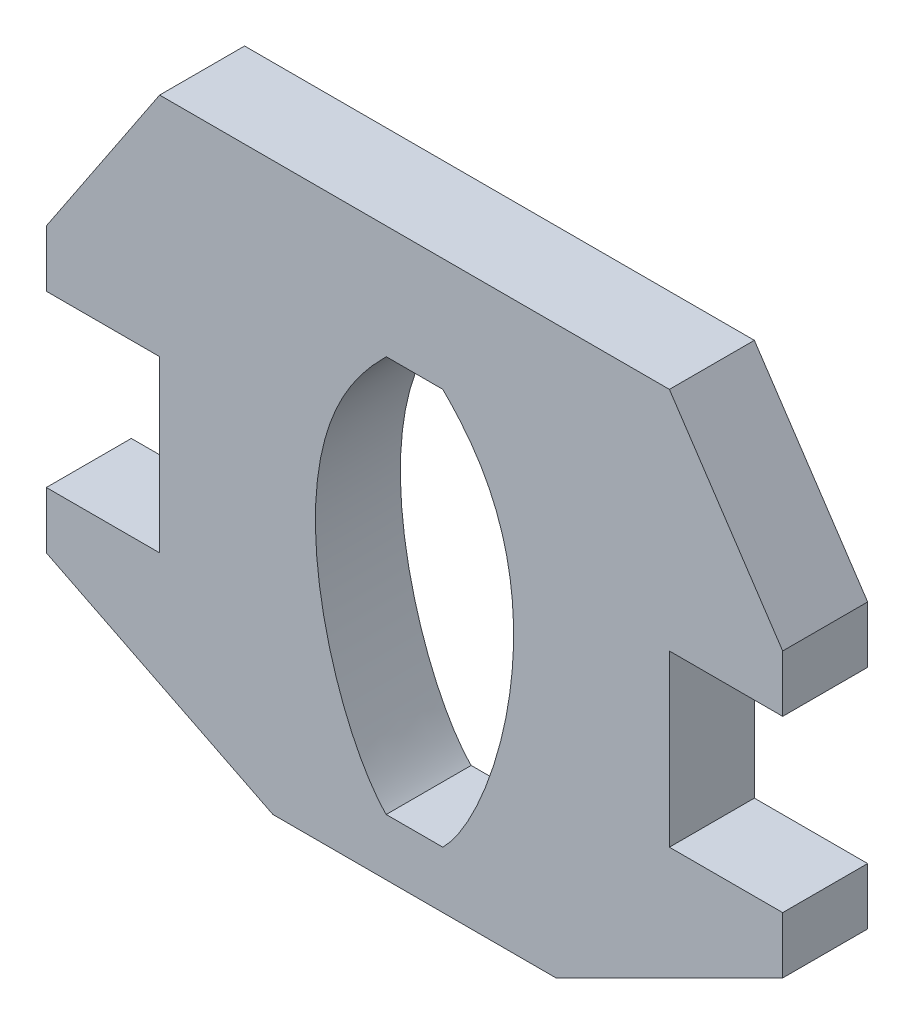
ISO-10303-21;
HEADER;
FILE_DESCRIPTION(('STEP AP214'),'2;1');
FILE_NAME('part.step','',(''),(''),'','','');
FILE_SCHEMA(('AUTOMOTIVE_DESIGN { 1 0 10303 214 1 1 1 1 }'));
ENDSEC;
DATA;
#1=APPLICATION_CONTEXT('core data for automotive mechanical design processes');
#2=APPLICATION_PROTOCOL_DEFINITION('international standard','automotive_design',2000,#1);
#3=PRODUCT_CONTEXT('',#1,'mechanical');
#4=PRODUCT('Part','Part','',(#3));
#5=PRODUCT_RELATED_PRODUCT_CATEGORY('part','',(#4));
#6=PRODUCT_DEFINITION_FORMATION('','',#4);
#7=PRODUCT_DEFINITION_CONTEXT('part definition',#1,'design');
#8=PRODUCT_DEFINITION('design','',#6,#7);
#9=PRODUCT_DEFINITION_SHAPE('','',#8);
#10=(LENGTH_UNIT() NAMED_UNIT(*) SI_UNIT(.MILLI.,.METRE.));
#11=(NAMED_UNIT(*) PLANE_ANGLE_UNIT() SI_UNIT($,.RADIAN.));
#12=(NAMED_UNIT(*) SI_UNIT($,.STERADIAN.) SOLID_ANGLE_UNIT());
#13=UNCERTAINTY_MEASURE_WITH_UNIT(LENGTH_MEASURE(1.E-05),#10,'distance_accuracy_value','');
#14=(GEOMETRIC_REPRESENTATION_CONTEXT(3) GLOBAL_UNCERTAINTY_ASSIGNED_CONTEXT((#13)) GLOBAL_UNIT_ASSIGNED_CONTEXT((#10,
#11,#12)) REPRESENTATION_CONTEXT('',''));
#15=CARTESIAN_POINT('',(0.,0.,0.));
#16=DIRECTION('',(0.,0.,1.));
#17=DIRECTION('',(1.,0.,0.));
#18=AXIS2_PLACEMENT_3D('',#15,#16,#17);
#19=CARTESIAN_POINT('',(0.,0.,15.));
#20=DIRECTION('',(0.,0.,1.));
#21=DIRECTION('',(1.,0.,0.));
#22=AXIS2_PLACEMENT_3D('',#19,#20,#21);
#23=PLANE('',#22);
#24=DIRECTION('',(-0.554700196225229,-0.832050294337844,0.));
#25=VECTOR('',#24,1.);
#26=CARTESIAN_POINT('',(-45.,50.,15.));
#27=LINE('',#26,#25);
#28=CARTESIAN_POINT('',(-45.,50.,15.));
#29=VERTEX_POINT('',#28);
#30=CARTESIAN_POINT('',(-65.,20.,15.));
#31=VERTEX_POINT('',#30);
#32=EDGE_CURVE('E331',#29,#31,#27,.T.);
#33=ORIENTED_EDGE('',*,*,#32,.T.);
#34=DIRECTION('',(0.,-1.,0.));
#35=VECTOR('',#34,1.);
#36=CARTESIAN_POINT('',(-65.,20.,15.));
#37=LINE('',#36,#35);
#38=CARTESIAN_POINT('',(-65.,10.,15.));
#39=VERTEX_POINT('',#38);
#40=EDGE_CURVE('E380',#31,#39,#37,.T.);
#41=ORIENTED_EDGE('',*,*,#40,.T.);
#42=DIRECTION('',(1.,0.,0.));
#43=VECTOR('',#42,1.);
#44=CARTESIAN_POINT('',(-65.,10.,15.));
#45=LINE('',#44,#43);
#46=CARTESIAN_POINT('',(-45.,10.,15.));
#47=VERTEX_POINT('',#46);
#48=EDGE_CURVE('E297',#39,#47,#45,.T.);
#49=ORIENTED_EDGE('',*,*,#48,.T.);
#50=DIRECTION('',(0.,-1.,0.));
#51=VECTOR('',#50,1.);
#52=CARTESIAN_POINT('',(-45.,10.,15.));
#53=LINE('',#52,#51);
#54=CARTESIAN_POINT('',(-45.,-20.,15.));
#55=VERTEX_POINT('',#54);
#56=EDGE_CURVE('E374',#47,#55,#53,.T.);
#57=ORIENTED_EDGE('',*,*,#56,.T.);
#58=DIRECTION('',(-1.,0.,0.));
#59=VECTOR('',#58,1.);
#60=CARTESIAN_POINT('',(-45.,-20.,15.));
#61=LINE('',#60,#59);
#62=CARTESIAN_POINT('',(-65.,-20.,15.));
#63=VERTEX_POINT('',#62);
#64=EDGE_CURVE('E376',#55,#63,#61,.T.);
#65=ORIENTED_EDGE('',*,*,#64,.T.);
#66=DIRECTION('',(0.,-1.,0.));
#67=VECTOR('',#66,1.);
#68=CARTESIAN_POINT('',(-65.,-20.,15.));
#69=LINE('',#68,#67);
#70=CARTESIAN_POINT('',(-65.,-30.,15.));
#71=VERTEX_POINT('',#70);
#72=EDGE_CURVE('E378',#63,#71,#69,.T.);
#73=ORIENTED_EDGE('',*,*,#72,.T.);
#74=DIRECTION('',(0.894427190999916,-0.447213595499958,0.));
#75=VECTOR('',#74,1.);
#76=CARTESIAN_POINT('',(-65.,-30.,15.));
#77=LINE('',#76,#75);
#78=CARTESIAN_POINT('',(-25.,-50.,15.));
#79=VERTEX_POINT('',#78);
#80=EDGE_CURVE('E385',#71,#79,#77,.T.);
#81=ORIENTED_EDGE('',*,*,#80,.T.);
#82=DIRECTION('',(1.,0.,0.));
#83=VECTOR('',#82,1.);
#84=CARTESIAN_POINT('',(25.,-50.,15.));
#85=LINE('',#84,#83);
#86=CARTESIAN_POINT('',(25.,-50.,15.));
#87=VERTEX_POINT('',#86);
#88=EDGE_CURVE('E387',#79,#87,#85,.T.);
#89=ORIENTED_EDGE('',*,*,#88,.T.);
#90=DIRECTION('',(0.894427190999916,0.447213595499958,0.));
#91=VECTOR('',#90,1.);
#92=CARTESIAN_POINT('',(65.,-30.,15.));
#93=LINE('',#92,#91);
#94=CARTESIAN_POINT('',(65.,-30.,15.));
#95=VERTEX_POINT('',#94);
#96=EDGE_CURVE('E389',#87,#95,#93,.T.);
#97=ORIENTED_EDGE('',*,*,#96,.T.);
#98=DIRECTION('',(0.,1.,0.));
#99=VECTOR('',#98,1.);
#100=CARTESIAN_POINT('',(65.,-20.,15.));
#101=LINE('',#100,#99);
#102=CARTESIAN_POINT('',(65.,-20.,15.));
#103=VERTEX_POINT('',#102);
#104=EDGE_CURVE('E391',#95,#103,#101,.T.);
#105=ORIENTED_EDGE('',*,*,#104,.T.);
#106=DIRECTION('',(-1.,0.,0.));
#107=VECTOR('',#106,1.);
#108=CARTESIAN_POINT('',(45.,-20.,15.));
#109=LINE('',#108,#107);
#110=CARTESIAN_POINT('',(45.,-20.,15.));
#111=VERTEX_POINT('',#110);
#112=EDGE_CURVE('E393',#103,#111,#109,.T.);
#113=ORIENTED_EDGE('',*,*,#112,.T.);
#114=DIRECTION('',(0.,1.,0.));
#115=VECTOR('',#114,1.);
#116=CARTESIAN_POINT('',(45.,10.,15.));
#117=LINE('',#116,#115);
#118=CARTESIAN_POINT('',(45.,10.,15.));
#119=VERTEX_POINT('',#118);
#120=EDGE_CURVE('E395',#111,#119,#117,.T.);
#121=ORIENTED_EDGE('',*,*,#120,.T.);
#122=DIRECTION('',(1.,0.,0.));
#123=VECTOR('',#122,1.);
#124=CARTESIAN_POINT('',(65.,10.,15.));
#125=LINE('',#124,#123);
#126=CARTESIAN_POINT('',(65.,10.,15.));
#127=VERTEX_POINT('',#126);
#128=EDGE_CURVE('E397',#119,#127,#125,.T.);
#129=ORIENTED_EDGE('',*,*,#128,.T.);
#130=DIRECTION('',(0.,1.,0.));
#131=VECTOR('',#130,1.);
#132=CARTESIAN_POINT('',(65.,20.,15.));
#133=LINE('',#132,#131);
#134=CARTESIAN_POINT('',(65.,20.,15.));
#135=VERTEX_POINT('',#134);
#136=EDGE_CURVE('E399',#127,#135,#133,.T.);
#137=ORIENTED_EDGE('',*,*,#136,.T.);
#138=DIRECTION('',(-0.554700196225229,0.832050294337843,0.));
#139=VECTOR('',#138,1.);
#140=CARTESIAN_POINT('',(45.,50.,15.));
#141=LINE('',#140,#139);
#142=CARTESIAN_POINT('',(45.,50.,15.));
#143=VERTEX_POINT('',#142);
#144=EDGE_CURVE('E401',#135,#143,#141,.T.);
#145=ORIENTED_EDGE('',*,*,#144,.T.);
#146=DIRECTION('',(-1.,0.,0.));
#147=VECTOR('',#146,1.);
#148=CARTESIAN_POINT('',(45.,50.,15.));
#149=LINE('',#148,#147);
#150=EDGE_CURVE('E336',#143,#29,#149,.T.);
#151=ORIENTED_EDGE('',*,*,#150,.T.);
#152=EDGE_LOOP('',(#33,#41,#49,#57,#65,#73,#81,#89,#97,#105,#113,#121,#129,#137,#145,#151));
#153=FACE_BOUND('',#152,.T.);
#154=DIRECTION('',(1.,0.,0.));
#155=VECTOR('',#154,1.);
#156=CARTESIAN_POINT('',(-5.,-40.,15.));
#157=LINE('',#156,#155);
#158=CARTESIAN_POINT('',(-5.,-40.,15.));
#159=VERTEX_POINT('',#158);
#160=CARTESIAN_POINT('',(5.00000000000002,-40.,15.));
#161=VERTEX_POINT('',#160);
#162=EDGE_CURVE('E178',#159,#161,#157,.T.);
#163=ORIENTED_EDGE('',*,*,#162,.F.);
#164=CARTESIAN_POINT('',(-5.,30.,15.));
#165=CARTESIAN_POINT('',(-15.,20.,15.));
#166=CARTESIAN_POINT('',(-25.,4.99999999999999,15.));
#167=CARTESIAN_POINT('',(-15.,-30.,15.));
#168=CARTESIAN_POINT('',(-5.,-40.,15.));
#169=B_SPLINE_CURVE_WITH_KNOTS('',4,(#164,#165,#166,#167,#168),.UNSPECIFIED.,.F.,.F.,(5,5),(0.,
1.),.UNSPECIFIED.);
#170=CARTESIAN_POINT('',(-5.,30.,15.));
#171=VERTEX_POINT('',#170);
#172=EDGE_CURVE('E170',#171,#159,#169,.T.);
#173=ORIENTED_EDGE('',*,*,#172,.F.);
#174=DIRECTION('',(-1.,0.,0.));
#175=VECTOR('',#174,1.);
#176=CARTESIAN_POINT('',(-5.,30.,15.));
#177=LINE('',#176,#175);
#178=CARTESIAN_POINT('',(5.,30.,15.));
#179=VERTEX_POINT('',#178);
#180=EDGE_CURVE('E192',#179,#171,#177,.T.);
#181=ORIENTED_EDGE('',*,*,#180,.F.);
#182=CARTESIAN_POINT('',(5.00000000000002,-40.,15.));
#183=CARTESIAN_POINT('',(15.,-30.,15.));
#184=CARTESIAN_POINT('',(25.,5.,15.));
#185=CARTESIAN_POINT('',(15.,20.,15.));
#186=CARTESIAN_POINT('',(5.,30.,15.));
#187=B_SPLINE_CURVE_WITH_KNOTS('',4,(#182,#183,#184,#185,#186),.UNSPECIFIED.,.F.,.F.,(5,5),(0.,
1.),.UNSPECIFIED.);
#188=EDGE_CURVE('E190',#161,#179,#187,.T.);
#189=ORIENTED_EDGE('',*,*,#188,.F.);
#190=EDGE_LOOP('',(#163,#173,#181,#189));
#191=FACE_BOUND('',#190,.T.);
#192=ADVANCED_FACE('F33',(#153,#191),#23,.T.);
#193=CARTESIAN_POINT('',(0.,0.,0.));
#194=DIRECTION('',(0.,0.,1.));
#195=DIRECTION('',(1.,0.,0.));
#196=AXIS2_PLACEMENT_3D('',#193,#194,#195);
#197=PLANE('',#196);
#198=DIRECTION('',(-0.554700196225229,-0.832050294337844,0.));
#199=VECTOR('',#198,1.);
#200=CARTESIAN_POINT('',(-45.,50.,0.));
#201=LINE('',#200,#199);
#202=CARTESIAN_POINT('',(-45.,50.,0.));
#203=VERTEX_POINT('',#202);
#204=CARTESIAN_POINT('',(-65.,20.,0.));
#205=VERTEX_POINT('',#204);
#206=EDGE_CURVE('E186',#203,#205,#201,.T.);
#207=ORIENTED_EDGE('',*,*,#206,.F.);
#208=DIRECTION('',(-1.,0.,0.));
#209=VECTOR('',#208,1.);
#210=CARTESIAN_POINT('',(45.,50.,0.));
#211=LINE('',#210,#209);
#212=CARTESIAN_POINT('',(45.,50.,0.));
#213=VERTEX_POINT('',#212);
#214=EDGE_CURVE('E329',#213,#203,#211,.T.);
#215=ORIENTED_EDGE('',*,*,#214,.F.);
#216=DIRECTION('',(-0.554700196225229,0.832050294337843,0.));
#217=VECTOR('',#216,1.);
#218=CARTESIAN_POINT('',(45.,50.,0.));
#219=LINE('',#218,#217);
#220=CARTESIAN_POINT('',(65.,20.,0.));
#221=VERTEX_POINT('',#220);
#222=EDGE_CURVE('E327',#221,#213,#219,.T.);
#223=ORIENTED_EDGE('',*,*,#222,.F.);
#224=DIRECTION('',(0.,1.,0.));
#225=VECTOR('',#224,1.);
#226=CARTESIAN_POINT('',(65.,20.,0.));
#227=LINE('',#226,#225);
#228=CARTESIAN_POINT('',(65.,10.,0.));
#229=VERTEX_POINT('',#228);
#230=EDGE_CURVE('E325',#229,#221,#227,.T.);
#231=ORIENTED_EDGE('',*,*,#230,.F.);
#232=DIRECTION('',(1.,0.,0.));
#233=VECTOR('',#232,1.);
#234=CARTESIAN_POINT('',(65.,10.,0.));
#235=LINE('',#234,#233);
#236=CARTESIAN_POINT('',(45.,10.,0.));
#237=VERTEX_POINT('',#236);
#238=EDGE_CURVE('E323',#237,#229,#235,.T.);
#239=ORIENTED_EDGE('',*,*,#238,.F.);
#240=DIRECTION('',(0.,1.,0.));
#241=VECTOR('',#240,1.);
#242=CARTESIAN_POINT('',(45.,10.,0.));
#243=LINE('',#242,#241);
#244=CARTESIAN_POINT('',(45.,-20.,0.));
#245=VERTEX_POINT('',#244);
#246=EDGE_CURVE('E321',#245,#237,#243,.T.);
#247=ORIENTED_EDGE('',*,*,#246,.F.);
#248=DIRECTION('',(-1.,0.,0.));
#249=VECTOR('',#248,1.);
#250=CARTESIAN_POINT('',(45.,-20.,0.));
#251=LINE('',#250,#249);
#252=CARTESIAN_POINT('',(65.,-20.,0.));
#253=VERTEX_POINT('',#252);
#254=EDGE_CURVE('E319',#253,#245,#251,.T.);
#255=ORIENTED_EDGE('',*,*,#254,.F.);
#256=DIRECTION('',(0.,1.,0.));
#257=VECTOR('',#256,1.);
#258=CARTESIAN_POINT('',(65.,-20.,0.));
#259=LINE('',#258,#257);
#260=CARTESIAN_POINT('',(65.,-30.,0.));
#261=VERTEX_POINT('',#260);
#262=EDGE_CURVE('E317',#261,#253,#259,.T.);
#263=ORIENTED_EDGE('',*,*,#262,.F.);
#264=DIRECTION('',(0.894427190999916,0.447213595499958,0.));
#265=VECTOR('',#264,1.);
#266=CARTESIAN_POINT('',(65.,-30.,0.));
#267=LINE('',#266,#265);
#268=CARTESIAN_POINT('',(25.,-50.,0.));
#269=VERTEX_POINT('',#268);
#270=EDGE_CURVE('E315',#269,#261,#267,.T.);
#271=ORIENTED_EDGE('',*,*,#270,.F.);
#272=DIRECTION('',(1.,0.,0.));
#273=VECTOR('',#272,1.);
#274=CARTESIAN_POINT('',(25.,-50.,0.));
#275=LINE('',#274,#273);
#276=CARTESIAN_POINT('',(-25.,-50.,0.));
#277=VERTEX_POINT('',#276);
#278=EDGE_CURVE('E313',#277,#269,#275,.T.);
#279=ORIENTED_EDGE('',*,*,#278,.F.);
#280=DIRECTION('',(0.894427190999916,-0.447213595499958,0.));
#281=VECTOR('',#280,1.);
#282=CARTESIAN_POINT('',(-65.,-30.,0.));
#283=LINE('',#282,#281);
#284=CARTESIAN_POINT('',(-65.,-30.,0.));
#285=VERTEX_POINT('',#284);
#286=EDGE_CURVE('E311',#285,#277,#283,.T.);
#287=ORIENTED_EDGE('',*,*,#286,.F.);
#288=DIRECTION('',(0.,-1.,0.));
#289=VECTOR('',#288,1.);
#290=CARTESIAN_POINT('',(-65.,-20.,0.));
#291=LINE('',#290,#289);
#292=CARTESIAN_POINT('',(-65.,-20.,0.));
#293=VERTEX_POINT('',#292);
#294=EDGE_CURVE('E309',#293,#285,#291,.T.);
#295=ORIENTED_EDGE('',*,*,#294,.F.);
#296=DIRECTION('',(-1.,0.,0.));
#297=VECTOR('',#296,1.);
#298=CARTESIAN_POINT('',(-45.,-20.,0.));
#299=LINE('',#298,#297);
#300=CARTESIAN_POINT('',(-45.,-20.,0.));
#301=VERTEX_POINT('',#300);
#302=EDGE_CURVE('E304',#301,#293,#299,.T.);
#303=ORIENTED_EDGE('',*,*,#302,.F.);
#304=DIRECTION('',(0.,-1.,0.));
#305=VECTOR('',#304,1.);
#306=CARTESIAN_POINT('',(-45.,10.,0.));
#307=LINE('',#306,#305);
#308=CARTESIAN_POINT('',(-45.,10.,0.));
#309=VERTEX_POINT('',#308);
#310=EDGE_CURVE('E302',#309,#301,#307,.T.);
#311=ORIENTED_EDGE('',*,*,#310,.F.);
#312=DIRECTION('',(1.,0.,0.));
#313=VECTOR('',#312,1.);
#314=CARTESIAN_POINT('',(-65.,10.,0.));
#315=LINE('',#314,#313);
#316=CARTESIAN_POINT('',(-65.,10.,0.));
#317=VERTEX_POINT('',#316);
#318=EDGE_CURVE('E293',#317,#309,#315,.T.);
#319=ORIENTED_EDGE('',*,*,#318,.F.);
#320=DIRECTION('',(0.,-1.,0.));
#321=VECTOR('',#320,1.);
#322=CARTESIAN_POINT('',(-65.,20.,0.));
#323=LINE('',#322,#321);
#324=EDGE_CURVE('E286',#205,#317,#323,.T.);
#325=ORIENTED_EDGE('',*,*,#324,.F.);
#326=EDGE_LOOP('',(#207,#215,#223,#231,#239,#247,#255,#263,#271,#279,#287,#295,#303,#311,#319,#325));
#327=FACE_BOUND('',#326,.T.);
#328=CARTESIAN_POINT('',(-5.,30.,0.));
#329=CARTESIAN_POINT('',(-15.,20.,0.));
#330=CARTESIAN_POINT('',(-25.,4.99999999999999,0.));
#331=CARTESIAN_POINT('',(-15.,-30.,0.));
#332=CARTESIAN_POINT('',(-5.,-40.,0.));
#333=B_SPLINE_CURVE_WITH_KNOTS('',4,(#328,#329,#330,#331,#332),.UNSPECIFIED.,.F.,.F.,(5,5),(0.,
1.),.UNSPECIFIED.);
#334=CARTESIAN_POINT('',(-5.,30.,0.));
#335=VERTEX_POINT('',#334);
#336=CARTESIAN_POINT('',(-5.,-40.,0.));
#337=VERTEX_POINT('',#336);
#338=EDGE_CURVE('E56',#335,#337,#333,.T.);
#339=ORIENTED_EDGE('',*,*,#338,.T.);
#340=DIRECTION('',(1.,0.,0.));
#341=VECTOR('',#340,1.);
#342=CARTESIAN_POINT('',(-5.,-40.,0.));
#343=LINE('',#342,#341);
#344=CARTESIAN_POINT('',(5.00000000000002,-40.,0.));
#345=VERTEX_POINT('',#344);
#346=EDGE_CURVE('E185',#337,#345,#343,.T.);
#347=ORIENTED_EDGE('',*,*,#346,.T.);
#348=CARTESIAN_POINT('',(5.00000000000002,-40.,0.));
#349=CARTESIAN_POINT('',(15.,-30.,0.));
#350=CARTESIAN_POINT('',(25.,5.,0.));
#351=CARTESIAN_POINT('',(15.,20.,0.));
#352=CARTESIAN_POINT('',(5.,30.,0.));
#353=B_SPLINE_CURVE_WITH_KNOTS('',4,(#348,#349,#350,#351,#352),.UNSPECIFIED.,.F.,.F.,(5,5),(0.,
1.),.UNSPECIFIED.);
#354=CARTESIAN_POINT('',(5.,30.,0.));
#355=VERTEX_POINT('',#354);
#356=EDGE_CURVE('E446',#345,#355,#353,.T.);
#357=ORIENTED_EDGE('',*,*,#356,.T.);
#358=DIRECTION('',(-1.,0.,0.));
#359=VECTOR('',#358,1.);
#360=CARTESIAN_POINT('',(-5.,30.,0.));
#361=LINE('',#360,#359);
#362=EDGE_CURVE('E179',#355,#335,#361,.T.);
#363=ORIENTED_EDGE('',*,*,#362,.T.);
#364=EDGE_LOOP('',(#339,#347,#357,#363));
#365=FACE_BOUND('',#364,.T.);
#366=ADVANCED_FACE('F219',(#327,#365),#197,.F.);
#367=CARTESIAN_POINT('',(-45.,50.,15.));
#368=DIRECTION('',(0.832050294337844,-0.554700196225229,0.));
#369=DIRECTION('',(0.554700196225229,0.832050294337844,0.));
#370=AXIS2_PLACEMENT_3D('',#367,#368,#369);
#371=PLANE('',#370);
#372=ORIENTED_EDGE('',*,*,#206,.T.);
#373=DIRECTION('',(0.,0.,-1.));
#374=VECTOR('',#373,1.);
#375=CARTESIAN_POINT('',(-65.,20.,15.));
#376=LINE('',#375,#374);
#377=EDGE_CURVE('E11',#31,#205,#376,.T.);
#378=ORIENTED_EDGE('',*,*,#377,.F.);
#379=ORIENTED_EDGE('',*,*,#32,.F.);
#380=DIRECTION('',(0.,0.,-1.));
#381=VECTOR('',#380,1.);
#382=CARTESIAN_POINT('',(-45.,50.,15.));
#383=LINE('',#382,#381);
#384=EDGE_CURVE('E332',#29,#203,#383,.T.);
#385=ORIENTED_EDGE('',*,*,#384,.T.);
#386=EDGE_LOOP('',(#372,#378,#379,#385));
#387=FACE_BOUND('',#386,.T.);
#388=ADVANCED_FACE('F35',(#387),#371,.F.);
#389=CARTESIAN_POINT('',(-65.,20.,15.));
#390=DIRECTION('',(1.,0.,0.));
#391=DIRECTION('',(0.,0.,-1.));
#392=AXIS2_PLACEMENT_3D('',#389,#390,#391);
#393=PLANE('',#392);
#394=ORIENTED_EDGE('',*,*,#324,.T.);
#395=DIRECTION('',(0.,0.,-1.));
#396=VECTOR('',#395,1.);
#397=CARTESIAN_POINT('',(-65.,10.,15.));
#398=LINE('',#397,#396);
#399=EDGE_CURVE('E41',#39,#317,#398,.T.);
#400=ORIENTED_EDGE('',*,*,#399,.F.);
#401=ORIENTED_EDGE('',*,*,#40,.F.);
#402=ORIENTED_EDGE('',*,*,#377,.T.);
#403=EDGE_LOOP('',(#394,#400,#401,#402));
#404=FACE_BOUND('',#403,.T.);
#405=ADVANCED_FACE('F277',(#404),#393,.F.);
#406=CARTESIAN_POINT('',(-65.,10.,15.));
#407=DIRECTION('',(0.,1.,0.));
#408=DIRECTION('',(0.,0.,1.));
#409=AXIS2_PLACEMENT_3D('',#406,#407,#408);
#410=PLANE('',#409);
#411=ORIENTED_EDGE('',*,*,#318,.T.);
#412=DIRECTION('',(0.,0.,-1.));
#413=VECTOR('',#412,1.);
#414=CARTESIAN_POINT('',(-45.,10.,15.));
#415=LINE('',#414,#413);
#416=EDGE_CURVE('E298',#47,#309,#415,.T.);
#417=ORIENTED_EDGE('',*,*,#416,.F.);
#418=ORIENTED_EDGE('',*,*,#48,.F.);
#419=ORIENTED_EDGE('',*,*,#399,.T.);
#420=EDGE_LOOP('',(#411,#417,#418,#419));
#421=FACE_BOUND('',#420,.T.);
#422=ADVANCED_FACE('F274',(#421),#410,.F.);
#423=CARTESIAN_POINT('',(-45.,10.,15.));
#424=DIRECTION('',(1.,0.,0.));
#425=DIRECTION('',(0.,1.,0.));
#426=AXIS2_PLACEMENT_3D('',#423,#424,#425);
#427=PLANE('',#426);
#428=ORIENTED_EDGE('',*,*,#310,.T.);
#429=DIRECTION('',(0.,0.,-1.));
#430=VECTOR('',#429,1.);
#431=CARTESIAN_POINT('',(-45.,-20.,15.));
#432=LINE('',#431,#430);
#433=EDGE_CURVE('E369',#55,#301,#432,.T.);
#434=ORIENTED_EDGE('',*,*,#433,.F.);
#435=ORIENTED_EDGE('',*,*,#56,.F.);
#436=ORIENTED_EDGE('',*,*,#416,.T.);
#437=EDGE_LOOP('',(#428,#434,#435,#436));
#438=FACE_BOUND('',#437,.T.);
#439=ADVANCED_FACE('F270',(#438),#427,.F.);
#440=CARTESIAN_POINT('',(-45.,-20.,15.));
#441=DIRECTION('',(0.,-1.,0.));
#442=DIRECTION('',(1.,0.,0.));
#443=AXIS2_PLACEMENT_3D('',#440,#441,#442);
#444=PLANE('',#443);
#445=ORIENTED_EDGE('',*,*,#302,.T.);
#446=DIRECTION('',(0.,0.,-1.));
#447=VECTOR('',#446,1.);
#448=CARTESIAN_POINT('',(-65.,-20.,15.));
#449=LINE('',#448,#447);
#450=EDGE_CURVE('E366',#63,#293,#449,.T.);
#451=ORIENTED_EDGE('',*,*,#450,.F.);
#452=ORIENTED_EDGE('',*,*,#64,.F.);
#453=ORIENTED_EDGE('',*,*,#433,.T.);
#454=EDGE_LOOP('',(#445,#451,#452,#453));
#455=FACE_BOUND('',#454,.T.);
#456=ADVANCED_FACE('F266',(#455),#444,.F.);
#457=CARTESIAN_POINT('',(-65.,-20.,15.));
#458=DIRECTION('',(1.,0.,0.));
#459=DIRECTION('',(0.,0.,-1.));
#460=AXIS2_PLACEMENT_3D('',#457,#458,#459);
#461=PLANE('',#460);
#462=ORIENTED_EDGE('',*,*,#294,.T.);
#463=DIRECTION('',(0.,0.,-1.));
#464=VECTOR('',#463,1.);
#465=CARTESIAN_POINT('',(-65.,-30.,15.));
#466=LINE('',#465,#464);
#467=EDGE_CURVE('E363',#71,#285,#466,.T.);
#468=ORIENTED_EDGE('',*,*,#467,.F.);
#469=ORIENTED_EDGE('',*,*,#72,.F.);
#470=ORIENTED_EDGE('',*,*,#450,.T.);
#471=EDGE_LOOP('',(#462,#468,#469,#470));
#472=FACE_BOUND('',#471,.T.);
#473=ADVANCED_FACE('F262',(#472),#461,.F.);
#474=CARTESIAN_POINT('',(-65.,-30.,15.));
#475=DIRECTION('',(0.447213595499958,0.894427190999916,0.));
#476=DIRECTION('',(-0.894427190999916,0.447213595499958,0.));
#477=AXIS2_PLACEMENT_3D('',#474,#475,#476);
#478=PLANE('',#477);
#479=ORIENTED_EDGE('',*,*,#286,.T.);
#480=DIRECTION('',(0.,0.,-1.));
#481=VECTOR('',#480,1.);
#482=CARTESIAN_POINT('',(-25.,-50.,15.));
#483=LINE('',#482,#481);
#484=EDGE_CURVE('E360',#79,#277,#483,.T.);
#485=ORIENTED_EDGE('',*,*,#484,.F.);
#486=ORIENTED_EDGE('',*,*,#80,.F.);
#487=ORIENTED_EDGE('',*,*,#467,.T.);
#488=EDGE_LOOP('',(#479,#485,#486,#487));
#489=FACE_BOUND('',#488,.T.);
#490=ADVANCED_FACE('F258',(#489),#478,.F.);
#491=CARTESIAN_POINT('',(25.,-50.,15.));
#492=DIRECTION('',(0.,1.,0.));
#493=DIRECTION('',(0.,0.,1.));
#494=AXIS2_PLACEMENT_3D('',#491,#492,#493);
#495=PLANE('',#494);
#496=ORIENTED_EDGE('',*,*,#278,.T.);
#497=DIRECTION('',(0.,0.,-1.));
#498=VECTOR('',#497,1.);
#499=CARTESIAN_POINT('',(25.,-50.,15.));
#500=LINE('',#499,#498);
#501=EDGE_CURVE('E357',#87,#269,#500,.T.);
#502=ORIENTED_EDGE('',*,*,#501,.F.);
#503=ORIENTED_EDGE('',*,*,#88,.F.);
#504=ORIENTED_EDGE('',*,*,#484,.T.);
#505=EDGE_LOOP('',(#496,#502,#503,#504));
#506=FACE_BOUND('',#505,.T.);
#507=ADVANCED_FACE('F254',(#506),#495,.F.);
#508=CARTESIAN_POINT('',(65.,-30.,15.));
#509=DIRECTION('',(-0.447213595499958,0.894427190999916,0.));
#510=DIRECTION('',(-0.894427190999916,-0.447213595499958,0.));
#511=AXIS2_PLACEMENT_3D('',#508,#509,#510);
#512=PLANE('',#511);
#513=ORIENTED_EDGE('',*,*,#270,.T.);
#514=DIRECTION('',(0.,0.,-1.));
#515=VECTOR('',#514,1.);
#516=CARTESIAN_POINT('',(65.,-30.,15.));
#517=LINE('',#516,#515);
#518=EDGE_CURVE('E354',#95,#261,#517,.T.);
#519=ORIENTED_EDGE('',*,*,#518,.F.);
#520=ORIENTED_EDGE('',*,*,#96,.F.);
#521=ORIENTED_EDGE('',*,*,#501,.T.);
#522=EDGE_LOOP('',(#513,#519,#520,#521));
#523=FACE_BOUND('',#522,.T.);
#524=ADVANCED_FACE('F250',(#523),#512,.F.);
#525=CARTESIAN_POINT('',(65.,-20.,15.));
#526=DIRECTION('',(-1.,0.,0.));
#527=DIRECTION('',(0.,0.,1.));
#528=AXIS2_PLACEMENT_3D('',#525,#526,#527);
#529=PLANE('',#528);
#530=ORIENTED_EDGE('',*,*,#262,.T.);
#531=DIRECTION('',(0.,0.,-1.));
#532=VECTOR('',#531,1.);
#533=CARTESIAN_POINT('',(65.,-20.,15.));
#534=LINE('',#533,#532);
#535=EDGE_CURVE('E351',#103,#253,#534,.T.);
#536=ORIENTED_EDGE('',*,*,#535,.F.);
#537=ORIENTED_EDGE('',*,*,#104,.F.);
#538=ORIENTED_EDGE('',*,*,#518,.T.);
#539=EDGE_LOOP('',(#530,#536,#537,#538));
#540=FACE_BOUND('',#539,.T.);
#541=ADVANCED_FACE('F246',(#540),#529,.F.);
#542=CARTESIAN_POINT('',(45.,-20.,15.));
#543=DIRECTION('',(0.,-1.,0.));
#544=DIRECTION('',(1.,0.,0.));
#545=AXIS2_PLACEMENT_3D('',#542,#543,#544);
#546=PLANE('',#545);
#547=ORIENTED_EDGE('',*,*,#254,.T.);
#548=DIRECTION('',(0.,0.,-1.));
#549=VECTOR('',#548,1.);
#550=CARTESIAN_POINT('',(45.,-20.,15.));
#551=LINE('',#550,#549);
#552=EDGE_CURVE('E348',#111,#245,#551,.T.);
#553=ORIENTED_EDGE('',*,*,#552,.F.);
#554=ORIENTED_EDGE('',*,*,#112,.F.);
#555=ORIENTED_EDGE('',*,*,#535,.T.);
#556=EDGE_LOOP('',(#547,#553,#554,#555));
#557=FACE_BOUND('',#556,.T.);
#558=ADVANCED_FACE('F242',(#557),#546,.F.);
#559=CARTESIAN_POINT('',(45.,10.,15.));
#560=DIRECTION('',(-1.,0.,0.));
#561=DIRECTION('',(0.,-1.,0.));
#562=AXIS2_PLACEMENT_3D('',#559,#560,#561);
#563=PLANE('',#562);
#564=ORIENTED_EDGE('',*,*,#246,.T.);
#565=DIRECTION('',(0.,0.,-1.));
#566=VECTOR('',#565,1.);
#567=CARTESIAN_POINT('',(45.,10.,15.));
#568=LINE('',#567,#566);
#569=EDGE_CURVE('E345',#119,#237,#568,.T.);
#570=ORIENTED_EDGE('',*,*,#569,.F.);
#571=ORIENTED_EDGE('',*,*,#120,.F.);
#572=ORIENTED_EDGE('',*,*,#552,.T.);
#573=EDGE_LOOP('',(#564,#570,#571,#572));
#574=FACE_BOUND('',#573,.T.);
#575=ADVANCED_FACE('F238',(#574),#563,.F.);
#576=CARTESIAN_POINT('',(65.,10.,15.));
#577=DIRECTION('',(0.,1.,0.));
#578=DIRECTION('',(0.,0.,1.));
#579=AXIS2_PLACEMENT_3D('',#576,#577,#578);
#580=PLANE('',#579);
#581=ORIENTED_EDGE('',*,*,#238,.T.);
#582=DIRECTION('',(0.,0.,-1.));
#583=VECTOR('',#582,1.);
#584=CARTESIAN_POINT('',(65.,10.,15.));
#585=LINE('',#584,#583);
#586=EDGE_CURVE('E342',#127,#229,#585,.T.);
#587=ORIENTED_EDGE('',*,*,#586,.F.);
#588=ORIENTED_EDGE('',*,*,#128,.F.);
#589=ORIENTED_EDGE('',*,*,#569,.T.);
#590=EDGE_LOOP('',(#581,#587,#588,#589));
#591=FACE_BOUND('',#590,.T.);
#592=ADVANCED_FACE('F234',(#591),#580,.F.);
#593=CARTESIAN_POINT('',(65.,20.,15.));
#594=DIRECTION('',(-1.,0.,0.));
#595=DIRECTION('',(0.,0.,1.));
#596=AXIS2_PLACEMENT_3D('',#593,#594,#595);
#597=PLANE('',#596);
#598=ORIENTED_EDGE('',*,*,#230,.T.);
#599=DIRECTION('',(0.,0.,-1.));
#600=VECTOR('',#599,1.);
#601=CARTESIAN_POINT('',(65.,20.,15.));
#602=LINE('',#601,#600);
#603=EDGE_CURVE('E339',#135,#221,#602,.T.);
#604=ORIENTED_EDGE('',*,*,#603,.F.);
#605=ORIENTED_EDGE('',*,*,#136,.F.);
#606=ORIENTED_EDGE('',*,*,#586,.T.);
#607=EDGE_LOOP('',(#598,#604,#605,#606));
#608=FACE_BOUND('',#607,.T.);
#609=ADVANCED_FACE('F230',(#608),#597,.F.);
#610=CARTESIAN_POINT('',(45.,50.,15.));
#611=DIRECTION('',(-0.832050294337843,-0.554700196225229,0.));
#612=DIRECTION('',(0.554700196225229,-0.832050294337843,0.));
#613=AXIS2_PLACEMENT_3D('',#610,#611,#612);
#614=PLANE('',#613);
#615=ORIENTED_EDGE('',*,*,#222,.T.);
#616=DIRECTION('',(0.,0.,-1.));
#617=VECTOR('',#616,1.);
#618=CARTESIAN_POINT('',(45.,50.,15.));
#619=LINE('',#618,#617);
#620=EDGE_CURVE('E335',#143,#213,#619,.T.);
#621=ORIENTED_EDGE('',*,*,#620,.F.);
#622=ORIENTED_EDGE('',*,*,#144,.F.);
#623=ORIENTED_EDGE('',*,*,#603,.T.);
#624=EDGE_LOOP('',(#615,#621,#622,#623));
#625=FACE_BOUND('',#624,.T.);
#626=ADVANCED_FACE('F226',(#625),#614,.F.);
#627=CARTESIAN_POINT('',(45.,50.,15.));
#628=DIRECTION('',(0.,-1.,0.));
#629=DIRECTION('',(1.,0.,0.));
#630=AXIS2_PLACEMENT_3D('',#627,#628,#629);
#631=PLANE('',#630);
#632=ORIENTED_EDGE('',*,*,#214,.T.);
#633=ORIENTED_EDGE('',*,*,#384,.F.);
#634=ORIENTED_EDGE('',*,*,#150,.F.);
#635=ORIENTED_EDGE('',*,*,#620,.T.);
#636=EDGE_LOOP('',(#632,#633,#634,#635));
#637=FACE_BOUND('',#636,.T.);
#638=ADVANCED_FACE('F216',(#637),#631,.F.);
#639=DIRECTION('',(0.,0.,-1.));
#640=VECTOR('',#639,1.);
#641=SURFACE_OF_LINEAR_EXTRUSION('',#169,#640);
#642=ORIENTED_EDGE('',*,*,#338,.F.);
#643=DIRECTION('',(0.,0.,-1.));
#644=VECTOR('',#643,1.);
#645=CARTESIAN_POINT('',(-5.,30.,15.));
#646=LINE('',#645,#644);
#647=EDGE_CURVE('E174',#171,#335,#646,.T.);
#648=ORIENTED_EDGE('',*,*,#647,.F.);
#649=ORIENTED_EDGE('',*,*,#172,.T.);
#650=DIRECTION('',(0.,0.,-1.));
#651=VECTOR('',#650,1.);
#652=CARTESIAN_POINT('',(-5.,-40.,15.));
#653=LINE('',#652,#651);
#654=EDGE_CURVE('E173',#159,#337,#653,.T.);
#655=ORIENTED_EDGE('',*,*,#654,.T.);
#656=EDGE_LOOP('',(#642,#648,#649,#655));
#657=FACE_BOUND('',#656,.T.);
#658=ADVANCED_FACE('F172',(#657),#641,.T.);
#659=CARTESIAN_POINT('',(-5.,-40.,15.));
#660=DIRECTION('',(0.,1.,0.));
#661=DIRECTION('',(0.,0.,1.));
#662=AXIS2_PLACEMENT_3D('',#659,#660,#661);
#663=PLANE('',#662);
#664=ORIENTED_EDGE('',*,*,#346,.F.);
#665=ORIENTED_EDGE('',*,*,#654,.F.);
#666=ORIENTED_EDGE('',*,*,#162,.T.);
#667=DIRECTION('',(0.,0.,-1.));
#668=VECTOR('',#667,1.);
#669=CARTESIAN_POINT('',(5.00000000000002,-40.,15.));
#670=LINE('',#669,#668);
#671=EDGE_CURVE('E187',#161,#345,#670,.T.);
#672=ORIENTED_EDGE('',*,*,#671,.T.);
#673=EDGE_LOOP('',(#664,#665,#666,#672));
#674=FACE_BOUND('',#673,.T.);
#675=ADVANCED_FACE('F182',(#674),#663,.T.);
#676=DIRECTION('',(0.,0.,-1.));
#677=VECTOR('',#676,1.);
#678=SURFACE_OF_LINEAR_EXTRUSION('',#187,#677);
#679=ORIENTED_EDGE('',*,*,#356,.F.);
#680=ORIENTED_EDGE('',*,*,#671,.F.);
#681=ORIENTED_EDGE('',*,*,#188,.T.);
#682=DIRECTION('',(0.,0.,-1.));
#683=VECTOR('',#682,1.);
#684=CARTESIAN_POINT('',(5.,30.,15.));
#685=LINE('',#684,#683);
#686=EDGE_CURVE('E48',#179,#355,#685,.T.);
#687=ORIENTED_EDGE('',*,*,#686,.T.);
#688=EDGE_LOOP('',(#679,#680,#681,#687));
#689=FACE_BOUND('',#688,.T.);
#690=ADVANCED_FACE('F206',(#689),#678,.T.);
#691=CARTESIAN_POINT('',(-5.,30.,15.));
#692=DIRECTION('',(0.,-1.,0.));
#693=DIRECTION('',(0.,0.,-1.));
#694=AXIS2_PLACEMENT_3D('',#691,#692,#693);
#695=PLANE('',#694);
#696=ORIENTED_EDGE('',*,*,#362,.F.);
#697=ORIENTED_EDGE('',*,*,#686,.F.);
#698=ORIENTED_EDGE('',*,*,#180,.T.);
#699=ORIENTED_EDGE('',*,*,#647,.T.);
#700=EDGE_LOOP('',(#696,#697,#698,#699));
#701=FACE_BOUND('',#700,.T.);
#702=ADVANCED_FACE('F210',(#701),#695,.T.);
#703=CLOSED_SHELL('',(#192,#366,#388,#405,#422,#439,#456,#473,#490,#507,#524,#541,#558,#575,
#592,#609,#626,#638,#658,#675,#690,#702));
#704=MANIFOLD_SOLID_BREP('B2',#703);
#705=ADVANCED_BREP_SHAPE_REPRESENTATION('',(#18,#704),#14);
#706=SHAPE_DEFINITION_REPRESENTATION(#9,#705);
ENDSEC;
END-ISO-10303-21;
